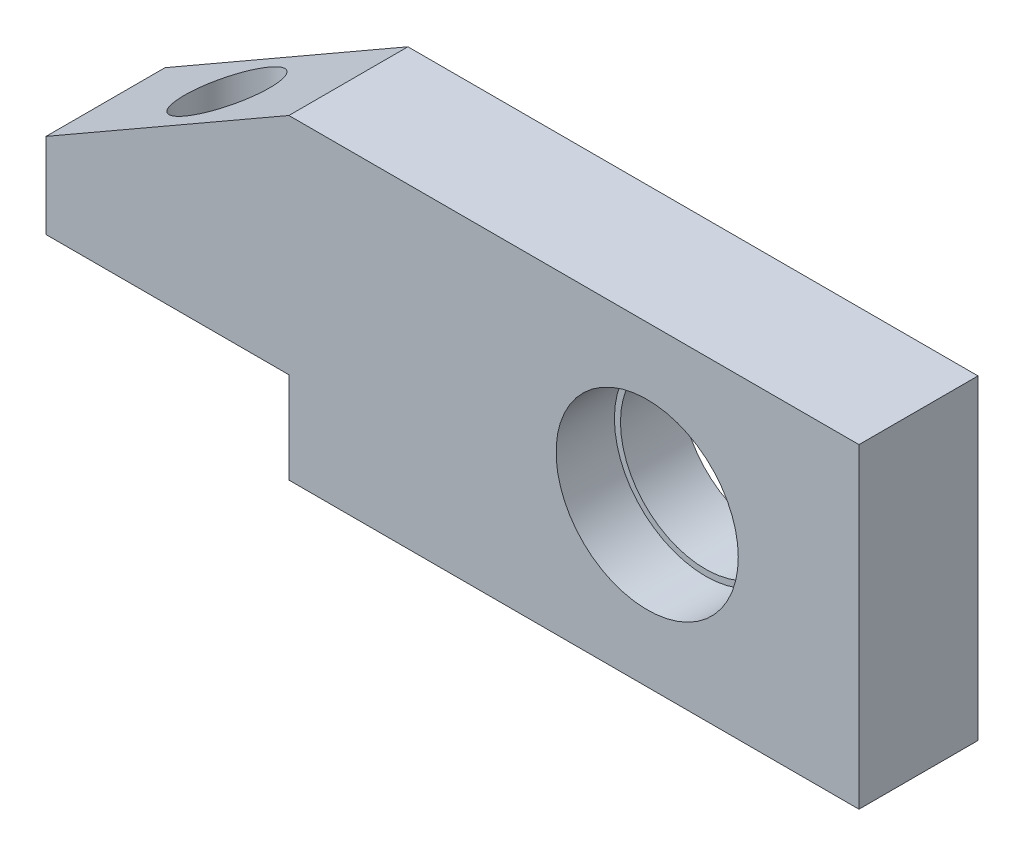
ISO-10303-21;
HEADER;
FILE_DESCRIPTION(('STEP AP214'),'2;1');
FILE_NAME('part.step','',(''),(''),'','','');
FILE_SCHEMA(('AUTOMOTIVE_DESIGN { 1 0 10303 214 1 1 1 1 }'));
ENDSEC;
DATA;
#1=APPLICATION_CONTEXT('core data for automotive mechanical design processes');
#2=APPLICATION_PROTOCOL_DEFINITION('international standard','automotive_design',2000,#1);
#3=PRODUCT_CONTEXT('',#1,'mechanical');
#4=PRODUCT('Part','Part','',(#3));
#5=PRODUCT_RELATED_PRODUCT_CATEGORY('part','',(#4));
#6=PRODUCT_DEFINITION_FORMATION('','',#4);
#7=PRODUCT_DEFINITION_CONTEXT('part definition',#1,'design');
#8=PRODUCT_DEFINITION('design','',#6,#7);
#9=PRODUCT_DEFINITION_SHAPE('','',#8);
#10=(LENGTH_UNIT() NAMED_UNIT(*) SI_UNIT(.MILLI.,.METRE.));
#11=(NAMED_UNIT(*) PLANE_ANGLE_UNIT() SI_UNIT($,.RADIAN.));
#12=(NAMED_UNIT(*) SI_UNIT($,.STERADIAN.) SOLID_ANGLE_UNIT());
#13=UNCERTAINTY_MEASURE_WITH_UNIT(LENGTH_MEASURE(1.E-05),#10,'distance_accuracy_value','');
#14=(GEOMETRIC_REPRESENTATION_CONTEXT(3) GLOBAL_UNCERTAINTY_ASSIGNED_CONTEXT((#13)) GLOBAL_UNIT_ASSIGNED_CONTEXT((#10,
#11,#12)) REPRESENTATION_CONTEXT('',''));
#15=CARTESIAN_POINT('',(0.,0.,0.));
#16=DIRECTION('',(0.,0.,1.));
#17=DIRECTION('',(1.,0.,0.));
#18=AXIS2_PLACEMENT_3D('',#15,#16,#17);
#19=CARTESIAN_POINT('',(15.0000000000001,10.5,4.8));
#20=DIRECTION('',(0.,0.,1.));
#21=DIRECTION('',(1.,0.,0.));
#22=AXIS2_PLACEMENT_3D('',#19,#20,#21);
#23=CYLINDRICAL_SURFACE('',#22,7.5);
#24=CARTESIAN_POINT('',(15.0000000000001,10.5,9.8));
#25=DIRECTION('',(0.,0.,1.));
#26=DIRECTION('',(1.,0.,0.));
#27=AXIS2_PLACEMENT_3D('',#24,#25,#26);
#28=CIRCLE('',#27,7.5);
#29=CARTESIAN_POINT('',(22.5000000000001,10.5,9.8));
#30=VERTEX_POINT('',#29);
#31=EDGE_CURVE('E121',#30,#30,#28,.T.);
#32=ORIENTED_EDGE('',*,*,#31,.T.);
#33=EDGE_LOOP('',(#32));
#34=FACE_BOUND('',#33,.T.);
#35=CARTESIAN_POINT('',(15.0000000000001,10.5,5.));
#36=DIRECTION('',(0.,0.,-1.));
#37=DIRECTION('',(-1.,0.,0.));
#38=AXIS2_PLACEMENT_3D('',#35,#36,#37);
#39=CIRCLE('',#38,7.5);
#40=CARTESIAN_POINT('',(7.50000000000007,10.5,5.));
#41=VERTEX_POINT('',#40);
#42=EDGE_CURVE('E11',#41,#41,#39,.F.);
#43=ORIENTED_EDGE('',*,*,#42,.F.);
#44=EDGE_LOOP('',(#43));
#45=FACE_BOUND('',#44,.T.);
#46=ADVANCED_FACE('F38',(#34,#45),#23,.F.);
#47=CARTESIAN_POINT('',(-34.5,5.01000000000016,0.));
#48=DIRECTION('',(0.,1.,0.));
#49=DIRECTION('',(0.,0.,1.));
#50=AXIS2_PLACEMENT_3D('',#47,#48,#49);
#51=PLANE('',#50);
#52=CARTESIAN_POINT('',(-24.5,5.01000000000017,4.9));
#53=DIRECTION('',(0.,-1.,0.));
#54=DIRECTION('',(0.,0.,-1.));
#55=AXIS2_PLACEMENT_3D('',#52,#53,#54);
#56=CIRCLE('',#55,2.);
#57=CARTESIAN_POINT('',(-24.5,5.01000000000017,2.9));
#58=VERTEX_POINT('',#57);
#59=EDGE_CURVE('E155',#58,#58,#56,.T.);
#60=ORIENTED_EDGE('',*,*,#59,.F.);
#61=EDGE_LOOP('',(#60));
#62=FACE_BOUND('',#61,.T.);
#63=DIRECTION('',(0.,0.,-1.));
#64=VECTOR('',#63,1.);
#65=CARTESIAN_POINT('',(-14.5,5.01000000000016,0.));
#66=LINE('',#65,#64);
#67=CARTESIAN_POINT('',(-14.5,5.01000000000016,9.8));
#68=VERTEX_POINT('',#67);
#69=CARTESIAN_POINT('',(-14.5,5.01000000000016,0.));
#70=VERTEX_POINT('',#69);
#71=EDGE_CURVE('E149',#68,#70,#66,.T.);
#72=ORIENTED_EDGE('',*,*,#71,.F.);
#73=DIRECTION('',(1.,0.,0.));
#74=VECTOR('',#73,1.);
#75=CARTESIAN_POINT('',(-34.5,5.01000000000017,9.8));
#76=LINE('',#75,#74);
#77=CARTESIAN_POINT('',(-34.5,5.01000000000017,9.8));
#78=VERTEX_POINT('',#77);
#79=EDGE_CURVE('E164',#78,#68,#76,.T.);
#80=ORIENTED_EDGE('',*,*,#79,.F.);
#81=DIRECTION('',(0.,0.,1.));
#82=VECTOR('',#81,1.);
#83=CARTESIAN_POINT('',(-34.5,5.01000000000016,0.));
#84=LINE('',#83,#82);
#85=CARTESIAN_POINT('',(-34.5,5.01000000000016,0.));
#86=VERTEX_POINT('',#85);
#87=EDGE_CURVE('E160',#86,#78,#84,.T.);
#88=ORIENTED_EDGE('',*,*,#87,.F.);
#89=DIRECTION('',(1.,0.,0.));
#90=VECTOR('',#89,1.);
#91=CARTESIAN_POINT('',(-34.5,5.01000000000016,0.));
#92=LINE('',#91,#90);
#93=EDGE_CURVE('E46',#86,#70,#92,.T.);
#94=ORIENTED_EDGE('',*,*,#93,.T.);
#95=EDGE_LOOP('',(#72,#80,#88,#94));
#96=FACE_BOUND('',#95,.T.);
#97=ADVANCED_FACE('F195',(#62,#96),#51,.F.);
#98=CARTESIAN_POINT('',(0.,0.,0.));
#99=DIRECTION('',(0.,0.,1.));
#100=DIRECTION('',(1.,0.,0.));
#101=AXIS2_PLACEMENT_3D('',#98,#99,#100);
#102=PLANE('',#101);
#103=DIRECTION('',(1.,0.,0.));
#104=VECTOR('',#103,1.);
#105=CARTESIAN_POINT('',(0.,-2.5,0.));
#106=LINE('',#105,#104);
#107=CARTESIAN_POINT('',(-14.5,-2.5,0.));
#108=VERTEX_POINT('',#107);
#109=CARTESIAN_POINT('',(32.4380131203289,-2.5,0.));
#110=VERTEX_POINT('',#109);
#111=EDGE_CURVE('E151',#108,#110,#106,.T.);
#112=ORIENTED_EDGE('',*,*,#111,.F.);
#113=DIRECTION('',(0.,-1.,0.));
#114=VECTOR('',#113,1.);
#115=CARTESIAN_POINT('',(-14.5,-2.5,0.));
#116=LINE('',#115,#114);
#117=EDGE_CURVE('E137',#70,#108,#116,.T.);
#118=ORIENTED_EDGE('',*,*,#117,.F.);
#119=ORIENTED_EDGE('',*,*,#93,.F.);
#120=DIRECTION('',(0.,-1.,0.));
#121=VECTOR('',#120,1.);
#122=CARTESIAN_POINT('',(-34.5,5.01000000000016,0.));
#123=LINE('',#122,#121);
#124=CARTESIAN_POINT('',(-34.5,12.0100000000002,0.));
#125=VERTEX_POINT('',#124);
#126=EDGE_CURVE('E158',#125,#86,#123,.T.);
#127=ORIENTED_EDGE('',*,*,#126,.F.);
#128=DIRECTION('',(0.867093589433399,0.498145267129482,0.));
#129=VECTOR('',#128,1.);
#130=CARTESIAN_POINT('',(-14.5,23.5,0.));
#131=LINE('',#130,#129);
#132=CARTESIAN_POINT('',(-14.5,23.5,0.));
#133=VERTEX_POINT('',#132);
#134=EDGE_CURVE('E102',#125,#133,#131,.T.);
#135=ORIENTED_EDGE('',*,*,#134,.T.);
#136=DIRECTION('',(-1.,0.,0.));
#137=VECTOR('',#136,1.);
#138=CARTESIAN_POINT('',(-0.00198687967107163,23.5,0.));
#139=LINE('',#138,#137);
#140=CARTESIAN_POINT('',(32.4380131203289,23.5,0.));
#141=VERTEX_POINT('',#140);
#142=EDGE_CURVE('E96',#141,#133,#139,.T.);
#143=ORIENTED_EDGE('',*,*,#142,.F.);
#144=DIRECTION('',(0.,1.,0.));
#145=VECTOR('',#144,1.);
#146=CARTESIAN_POINT('',(32.4380131203289,-2.5,0.));
#147=LINE('',#146,#145);
#148=EDGE_CURVE('E100',#110,#141,#147,.T.);
#149=ORIENTED_EDGE('',*,*,#148,.F.);
#150=EDGE_LOOP('',(#112,#118,#119,#127,#135,#143,#149));
#151=FACE_BOUND('',#150,.T.);
#152=CARTESIAN_POINT('',(15.0000000000001,10.5,0.));
#153=DIRECTION('',(0.,0.,-1.));
#154=DIRECTION('',(-1.,0.,0.));
#155=AXIS2_PLACEMENT_3D('',#152,#153,#154);
#156=CIRCLE('',#155,7.);
#157=CARTESIAN_POINT('',(8.00000000000007,10.5,0.));
#158=VERTEX_POINT('',#157);
#159=EDGE_CURVE('E395',#158,#158,#156,.T.);
#160=ORIENTED_EDGE('',*,*,#159,.F.);
#161=EDGE_LOOP('',(#160));
#162=FACE_BOUND('',#161,.T.);
#163=ADVANCED_FACE('F40',(#151,#162),#102,.F.);
#164=CARTESIAN_POINT('',(0.,0.,9.8));
#165=DIRECTION('',(0.,0.,1.));
#166=DIRECTION('',(1.,0.,0.));
#167=AXIS2_PLACEMENT_3D('',#164,#165,#166);
#168=PLANE('',#167);
#169=DIRECTION('',(0.,1.,0.));
#170=VECTOR('',#169,1.);
#171=CARTESIAN_POINT('',(-14.5,-2.5,9.8));
#172=LINE('',#171,#170);
#173=CARTESIAN_POINT('',(-14.5,-2.5,9.8));
#174=VERTEX_POINT('',#173);
#175=EDGE_CURVE('E145',#174,#68,#172,.T.);
#176=ORIENTED_EDGE('',*,*,#175,.F.);
#177=DIRECTION('',(-1.,0.,0.));
#178=VECTOR('',#177,1.);
#179=CARTESIAN_POINT('',(0.,-2.5,9.8));
#180=LINE('',#179,#178);
#181=CARTESIAN_POINT('',(32.4380131203289,-2.5,9.8));
#182=VERTEX_POINT('',#181);
#183=EDGE_CURVE('E107',#182,#174,#180,.T.);
#184=ORIENTED_EDGE('',*,*,#183,.F.);
#185=DIRECTION('',(0.,-1.,0.));
#186=VECTOR('',#185,1.);
#187=CARTESIAN_POINT('',(32.4380131203289,-2.5,9.8));
#188=LINE('',#187,#186);
#189=CARTESIAN_POINT('',(32.4380131203289,23.5,9.8));
#190=VERTEX_POINT('',#189);
#191=EDGE_CURVE('E115',#190,#182,#188,.T.);
#192=ORIENTED_EDGE('',*,*,#191,.F.);
#193=DIRECTION('',(1.,0.,0.));
#194=VECTOR('',#193,1.);
#195=CARTESIAN_POINT('',(0.,23.5,9.8));
#196=LINE('',#195,#194);
#197=CARTESIAN_POINT('',(-14.5,23.5,9.8));
#198=VERTEX_POINT('',#197);
#199=EDGE_CURVE('E106',#198,#190,#196,.T.);
#200=ORIENTED_EDGE('',*,*,#199,.F.);
#201=DIRECTION('',(0.867093589433399,0.498145267129482,0.));
#202=VECTOR('',#201,1.);
#203=CARTESIAN_POINT('',(-14.5,23.5,9.8));
#204=LINE('',#203,#202);
#205=CARTESIAN_POINT('',(-34.5,12.0100000000002,9.8));
#206=VERTEX_POINT('',#205);
#207=EDGE_CURVE('E134',#206,#198,#204,.T.);
#208=ORIENTED_EDGE('',*,*,#207,.F.);
#209=DIRECTION('',(0.,1.,0.));
#210=VECTOR('',#209,1.);
#211=CARTESIAN_POINT('',(-34.5,5.01000000000017,9.8));
#212=LINE('',#211,#210);
#213=EDGE_CURVE('E58',#78,#206,#212,.T.);
#214=ORIENTED_EDGE('',*,*,#213,.F.);
#215=ORIENTED_EDGE('',*,*,#79,.T.);
#216=EDGE_LOOP('',(#176,#184,#192,#200,#208,#214,#215));
#217=FACE_BOUND('',#216,.T.);
#218=ORIENTED_EDGE('',*,*,#31,.F.);
#219=EDGE_LOOP('',(#218));
#220=FACE_BOUND('',#219,.T.);
#221=ADVANCED_FACE('F184',(#217,#220),#168,.T.);
#222=CARTESIAN_POINT('',(-34.5,0.,0.));
#223=DIRECTION('',(1.,0.,0.));
#224=DIRECTION('',(0.,0.,-1.));
#225=AXIS2_PLACEMENT_3D('',#222,#223,#224);
#226=PLANE('',#225);
#227=ORIENTED_EDGE('',*,*,#126,.T.);
#228=ORIENTED_EDGE('',*,*,#87,.T.);
#229=ORIENTED_EDGE('',*,*,#213,.T.);
#230=DIRECTION('',(0.,0.,-1.));
#231=VECTOR('',#230,1.);
#232=CARTESIAN_POINT('',(-34.5,12.0100000000002,0.));
#233=LINE('',#232,#231);
#234=EDGE_CURVE('E53',#206,#125,#233,.T.);
#235=ORIENTED_EDGE('',*,*,#234,.T.);
#236=EDGE_LOOP('',(#227,#228,#229,#235));
#237=FACE_BOUND('',#236,.T.);
#238=ADVANCED_FACE('F196',(#237),#226,.F.);
#239=CARTESIAN_POINT('',(-24.5,25.0100000000002,4.9));
#240=DIRECTION('',(0.,-1.,0.));
#241=DIRECTION('',(0.,0.,-1.));
#242=AXIS2_PLACEMENT_3D('',#239,#240,#241);
#243=CYLINDRICAL_SURFACE('',#242,2.);
#244=ORIENTED_EDGE('',*,*,#59,.T.);
#245=EDGE_LOOP('',(#244));
#246=FACE_BOUND('',#245,.T.);
#247=CARTESIAN_POINT('',(-24.5,12.0100000000002,4.9));
#248=DIRECTION('',(0.,-1.,0.));
#249=DIRECTION('',(0.,0.,-1.));
#250=AXIS2_PLACEMENT_3D('',#247,#248,#249);
#251=CIRCLE('',#250,2.);
#252=CARTESIAN_POINT('',(-24.5,12.0100000000002,2.9));
#253=VERTEX_POINT('',#252);
#254=EDGE_CURVE('E139',#253,#253,#251,.T.);
#255=ORIENTED_EDGE('',*,*,#254,.F.);
#256=EDGE_LOOP('',(#255));
#257=FACE_BOUND('',#256,.T.);
#258=ADVANCED_FACE('F198',(#246,#257),#243,.F.);
#259=CARTESIAN_POINT('',(-0.00198687967107163,23.5,20.));
#260=DIRECTION('',(0.,-1.,0.));
#261=DIRECTION('',(1.,0.,0.));
#262=AXIS2_PLACEMENT_3D('',#259,#260,#261);
#263=PLANE('',#262);
#264=ORIENTED_EDGE('',*,*,#199,.T.);
#265=DIRECTION('',(0.,0.,1.));
#266=VECTOR('',#265,1.);
#267=CARTESIAN_POINT('',(32.4380131203289,23.5,0.));
#268=LINE('',#267,#266);
#269=EDGE_CURVE('E110',#141,#190,#268,.T.);
#270=ORIENTED_EDGE('',*,*,#269,.F.);
#271=ORIENTED_EDGE('',*,*,#142,.T.);
#272=DIRECTION('',(0.,0.,-1.));
#273=VECTOR('',#272,1.);
#274=CARTESIAN_POINT('',(-14.5,23.5,0.));
#275=LINE('',#274,#273);
#276=EDGE_CURVE('E147',#198,#133,#275,.T.);
#277=ORIENTED_EDGE('',*,*,#276,.F.);
#278=EDGE_LOOP('',(#264,#270,#271,#277));
#279=FACE_BOUND('',#278,.T.);
#280=ADVANCED_FACE('F111',(#279),#263,.F.);
#281=CARTESIAN_POINT('',(0.,-2.5,0.));
#282=DIRECTION('',(0.,1.,0.));
#283=DIRECTION('',(0.,0.,1.));
#284=AXIS2_PLACEMENT_3D('',#281,#282,#283);
#285=PLANE('',#284);
#286=ORIENTED_EDGE('',*,*,#183,.T.);
#287=DIRECTION('',(0.,0.,1.));
#288=VECTOR('',#287,1.);
#289=CARTESIAN_POINT('',(-14.5,-2.5,0.));
#290=LINE('',#289,#288);
#291=EDGE_CURVE('E142',#108,#174,#290,.T.);
#292=ORIENTED_EDGE('',*,*,#291,.F.);
#293=ORIENTED_EDGE('',*,*,#111,.T.);
#294=DIRECTION('',(0.,0.,-1.));
#295=VECTOR('',#294,1.);
#296=CARTESIAN_POINT('',(32.4380131203289,-2.5,0.));
#297=LINE('',#296,#295);
#298=EDGE_CURVE('E120',#182,#110,#297,.T.);
#299=ORIENTED_EDGE('',*,*,#298,.F.);
#300=EDGE_LOOP('',(#286,#292,#293,#299));
#301=FACE_BOUND('',#300,.T.);
#302=ADVANCED_FACE('F187',(#301),#285,.F.);
#303=CARTESIAN_POINT('',(-14.5,0.,0.));
#304=DIRECTION('',(1.,0.,0.));
#305=DIRECTION('',(0.,0.,-1.));
#306=AXIS2_PLACEMENT_3D('',#303,#304,#305);
#307=PLANE('',#306);
#308=ORIENTED_EDGE('',*,*,#175,.T.);
#309=ORIENTED_EDGE('',*,*,#71,.T.);
#310=ORIENTED_EDGE('',*,*,#117,.T.);
#311=ORIENTED_EDGE('',*,*,#291,.T.);
#312=EDGE_LOOP('',(#308,#309,#310,#311));
#313=FACE_BOUND('',#312,.T.);
#314=ADVANCED_FACE('F179',(#313),#307,.F.);
#315=CARTESIAN_POINT('',(-14.5,23.5,9.8));
#316=DIRECTION('',(-0.498145267129482,0.8670935894334,0.));
#317=DIRECTION('',(-0.8670935894334,-0.498145267129482,0.));
#318=AXIS2_PLACEMENT_3D('',#315,#316,#317);
#319=PLANE('',#318);
#320=CARTESIAN_POINT('',(-24.5,17.7550000000001,4.9));
#321=DIRECTION('',(-0.498145267129482,0.8670935894334,0.));
#322=DIRECTION('',(-0.8670935894334,-0.498145267129482,0.));
#323=AXIS2_PLACEMENT_3D('',#320,#321,#322);
#324=ELLIPSE('',#323,4.03647315889749,3.5);
#325=CARTESIAN_POINT('',(-28.,15.7442500000001,4.9));
#326=VERTEX_POINT('',#325);
#327=EDGE_CURVE('E133',#326,#326,#324,.T.);
#328=ORIENTED_EDGE('',*,*,#327,.F.);
#329=EDGE_LOOP('',(#328));
#330=FACE_BOUND('',#329,.T.);
#331=ORIENTED_EDGE('',*,*,#134,.F.);
#332=ORIENTED_EDGE('',*,*,#234,.F.);
#333=ORIENTED_EDGE('',*,*,#207,.T.);
#334=ORIENTED_EDGE('',*,*,#276,.T.);
#335=EDGE_LOOP('',(#331,#332,#333,#334));
#336=FACE_BOUND('',#335,.T.);
#337=ADVANCED_FACE('F176',(#330,#336),#319,.T.);
#338=CARTESIAN_POINT('',(-24.5,26.5100000000002,4.9));
#339=DIRECTION('',(0.,-1.,0.));
#340=DIRECTION('',(0.,0.,-1.));
#341=AXIS2_PLACEMENT_3D('',#338,#339,#340);
#342=CYLINDRICAL_SURFACE('',#341,3.5);
#343=ORIENTED_EDGE('',*,*,#327,.T.);
#344=EDGE_LOOP('',(#343));
#345=FACE_BOUND('',#344,.T.);
#346=CARTESIAN_POINT('',(-24.5,12.0100000000002,4.9));
#347=DIRECTION('',(0.,-1.,0.));
#348=DIRECTION('',(0.,0.,-1.));
#349=AXIS2_PLACEMENT_3D('',#346,#347,#348);
#350=CIRCLE('',#349,3.5);
#351=CARTESIAN_POINT('',(-24.5,12.0100000000002,1.4));
#352=VERTEX_POINT('',#351);
#353=EDGE_CURVE('E130',#352,#352,#350,.T.);
#354=ORIENTED_EDGE('',*,*,#353,.T.);
#355=EDGE_LOOP('',(#354));
#356=FACE_BOUND('',#355,.T.);
#357=ADVANCED_FACE('F173',(#345,#356),#342,.F.);
#358=CARTESIAN_POINT('',(-24.5,12.0100000000002,4.9));
#359=DIRECTION('',(0.,-1.,0.));
#360=DIRECTION('',(0.,0.,-1.));
#361=AXIS2_PLACEMENT_3D('',#358,#359,#360);
#362=PLANE('',#361);
#363=ORIENTED_EDGE('',*,*,#254,.T.);
#364=EDGE_LOOP('',(#363));
#365=FACE_BOUND('',#364,.T.);
#366=ORIENTED_EDGE('',*,*,#353,.F.);
#367=EDGE_LOOP('',(#366));
#368=FACE_BOUND('',#367,.T.);
#369=ADVANCED_FACE('F221',(#365,#368),#362,.F.);
#370=CARTESIAN_POINT('',(32.4380131203289,0.,0.));
#371=DIRECTION('',(1.,0.,0.));
#372=DIRECTION('',(0.,0.,-1.));
#373=AXIS2_PLACEMENT_3D('',#370,#371,#372);
#374=PLANE('',#373);
#375=ORIENTED_EDGE('',*,*,#148,.T.);
#376=ORIENTED_EDGE('',*,*,#269,.T.);
#377=ORIENTED_EDGE('',*,*,#191,.T.);
#378=ORIENTED_EDGE('',*,*,#298,.T.);
#379=EDGE_LOOP('',(#375,#376,#377,#378));
#380=FACE_BOUND('',#379,.T.);
#381=ADVANCED_FACE('F118',(#380),#374,.T.);
#382=CARTESIAN_POINT('',(15.0000000000001,10.5,5.));
#383=DIRECTION('',(0.,0.,-1.));
#384=DIRECTION('',(-1.,0.,0.));
#385=AXIS2_PLACEMENT_3D('',#382,#383,#384);
#386=PLANE('',#385);
#387=CARTESIAN_POINT('',(15.0000000000001,10.5,5.));
#388=DIRECTION('',(0.,0.,-1.));
#389=DIRECTION('',(-1.,0.,0.));
#390=AXIS2_PLACEMENT_3D('',#387,#388,#389);
#391=CIRCLE('',#390,7.);
#392=CARTESIAN_POINT('',(8.00000000000007,10.5,5.));
#393=VERTEX_POINT('',#392);
#394=EDGE_CURVE('E124',#393,#393,#391,.T.);
#395=ORIENTED_EDGE('',*,*,#394,.T.);
#396=EDGE_LOOP('',(#395));
#397=FACE_BOUND('',#396,.T.);
#398=ORIENTED_EDGE('',*,*,#42,.T.);
#399=EDGE_LOOP('',(#398));
#400=FACE_BOUND('',#399,.T.);
#401=ADVANCED_FACE('F217',(#397,#400),#386,.F.);
#402=CARTESIAN_POINT('',(15.0000000000001,10.5,5.));
#403=DIRECTION('',(0.,0.,-1.));
#404=DIRECTION('',(-1.,0.,0.));
#405=AXIS2_PLACEMENT_3D('',#402,#403,#404);
#406=CYLINDRICAL_SURFACE('',#405,7.);
#407=ORIENTED_EDGE('',*,*,#394,.F.);
#408=EDGE_LOOP('',(#407));
#409=FACE_BOUND('',#408,.T.);
#410=ORIENTED_EDGE('',*,*,#159,.T.);
#411=EDGE_LOOP('',(#410));
#412=FACE_BOUND('',#411,.T.);
#413=ADVANCED_FACE('F268',(#409,#412),#406,.F.);
#414=CLOSED_SHELL('',(#46,#97,#163,#221,#238,#258,#280,#302,#314,#337,#357,#369,#381,#401,#413));
#415=MANIFOLD_SOLID_BREP('B2',#414);
#416=ADVANCED_BREP_SHAPE_REPRESENTATION('',(#18,#415),#14);
#417=SHAPE_DEFINITION_REPRESENTATION(#9,#416);
ENDSEC;
END-ISO-10303-21;
